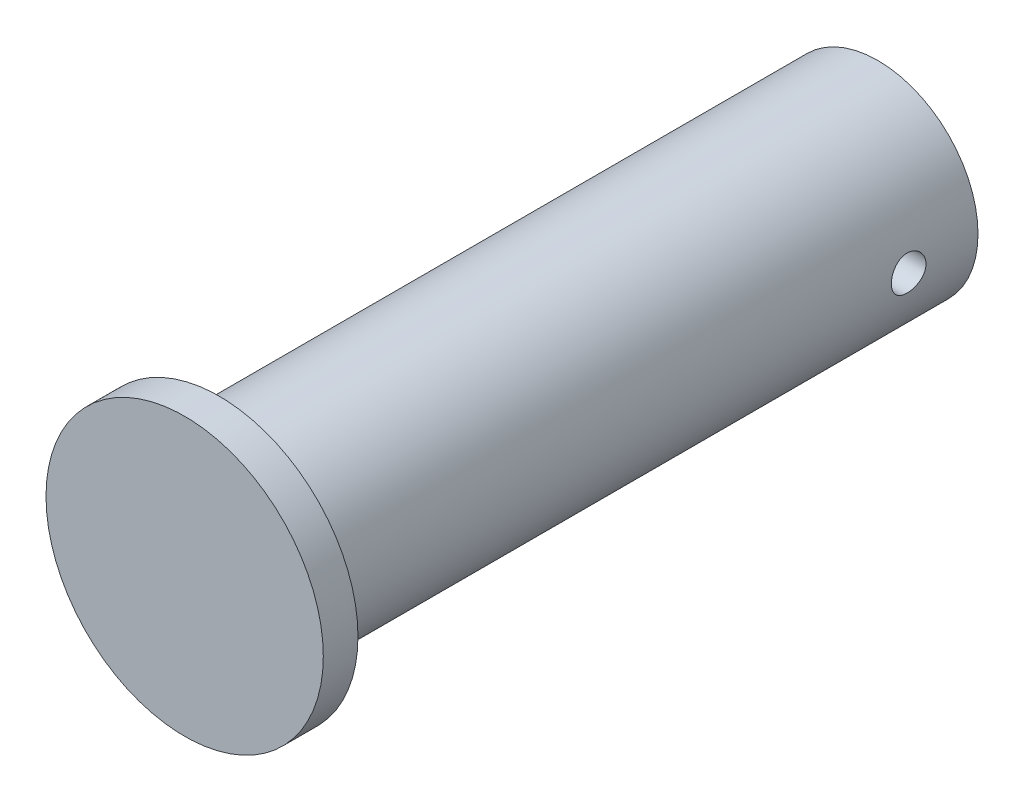
ISO-10303-21;
HEADER;
FILE_DESCRIPTION(('STEP AP214'),'2;1');
FILE_NAME('part.step','',(''),(''),'','','');
FILE_SCHEMA(('AUTOMOTIVE_DESIGN { 1 0 10303 214 1 1 1 1 }'));
ENDSEC;
DATA;
#1=APPLICATION_CONTEXT('core data for automotive mechanical design processes');
#2=APPLICATION_PROTOCOL_DEFINITION('international standard','automotive_design',2000,#1);
#3=PRODUCT_CONTEXT('',#1,'mechanical');
#4=PRODUCT('Part','Part','',(#3));
#5=PRODUCT_RELATED_PRODUCT_CATEGORY('part','',(#4));
#6=PRODUCT_DEFINITION_FORMATION('','',#4);
#7=PRODUCT_DEFINITION_CONTEXT('part definition',#1,'design');
#8=PRODUCT_DEFINITION('design','',#6,#7);
#9=PRODUCT_DEFINITION_SHAPE('','',#8);
#10=(LENGTH_UNIT() NAMED_UNIT(*) SI_UNIT(.MILLI.,.METRE.));
#11=(NAMED_UNIT(*) PLANE_ANGLE_UNIT() SI_UNIT($,.RADIAN.));
#12=(NAMED_UNIT(*) SI_UNIT($,.STERADIAN.) SOLID_ANGLE_UNIT());
#13=UNCERTAINTY_MEASURE_WITH_UNIT(LENGTH_MEASURE(1.E-05),#10,'distance_accuracy_value','');
#14=(GEOMETRIC_REPRESENTATION_CONTEXT(3) GLOBAL_UNCERTAINTY_ASSIGNED_CONTEXT((#13)) GLOBAL_UNIT_ASSIGNED_CONTEXT((#10,
#11,#12)) REPRESENTATION_CONTEXT('',''));
#15=CARTESIAN_POINT('',(0.,0.,0.));
#16=DIRECTION('',(0.,0.,1.));
#17=DIRECTION('',(1.,0.,0.));
#18=AXIS2_PLACEMENT_3D('',#15,#16,#17);
#19=CARTESIAN_POINT('',(0.,0.,100.));
#20=DIRECTION('',(0.,0.,-1.));
#21=DIRECTION('',(-1.,0.,0.));
#22=AXIS2_PLACEMENT_3D('',#19,#20,#21);
#23=CYLINDRICAL_SURFACE('',#22,14.44);
#24=CARTESIAN_POINT('',(-14.44,0.,12.5));
#25=CARTESIAN_POINT('',(-14.4399975634753,-0.13930998473073,12.49999448749));
#26=CARTESIAN_POINT('',(-14.4379630645383,-0.278693988960265,12.4883162957658));
#27=CARTESIAN_POINT('',(-14.43004300958,-0.553547196740739,12.4419346772616));
#28=CARTESIAN_POINT('',(-14.4241539990652,-0.689012774690595,12.4072105958845));
#29=CARTESIAN_POINT('',(-14.4091849248858,-0.952013276040617,12.3158216422762));
#30=CARTESIAN_POINT('',(-14.4001075536441,-1.07955478433479,12.2591752783003));
#31=CARTESIAN_POINT('',(-14.3797577944102,-1.32330820467692,12.1255994542479));
#32=CARTESIAN_POINT('',(-14.3684856354341,-1.43952129689679,12.0486721101037));
#33=CARTESIAN_POINT('',(-14.3448646796008,-1.6585289041156,11.8758771076849));
#34=CARTESIAN_POINT('',(-14.332506926838,-1.76119004399542,11.7798416106013));
#35=CARTESIAN_POINT('',(-14.3081755005597,-1.94902694553835,11.57191761267));
#36=CARTESIAN_POINT('',(-14.2962018522908,-2.03420155981216,11.460028072363));
#37=CARTESIAN_POINT('',(-14.2739075359928,-2.18518821661275,11.2226479708659));
#38=CARTESIAN_POINT('',(-14.2635984339907,-2.25086723151177,11.0970716155801));
#39=CARTESIAN_POINT('',(-14.2459253176367,-2.36014735110206,10.8364600028516));
#40=CARTESIAN_POINT('',(-14.2385610881339,-2.40375006873948,10.7014254372687));
#41=CARTESIAN_POINT('',(-14.2277009947425,-2.46721728094033,10.4271484628957));
#42=CARTESIAN_POINT('',(-14.2241675154832,-2.4873127581693,10.2879610210428));
#43=CARTESIAN_POINT('',(-14.2212553307796,-2.50391145576784,10.0081484969654));
#44=CARTESIAN_POINT('',(-14.2218763080439,-2.50041647782808,9.86752352534953));
#45=CARTESIAN_POINT('',(-14.2271685581324,-2.47012136396667,9.59048391104691));
#46=CARTESIAN_POINT('',(-14.2317945706192,-2.44358164359672,9.45403980013905));
#47=CARTESIAN_POINT('',(-14.24450473742,-2.36835951888826,9.18757062063627));
#48=CARTESIAN_POINT('',(-14.2525890188577,-2.31967630056528,9.05754578820577));
#49=CARTESIAN_POINT('',(-14.2713532513662,-2.20128789642092,8.80683176065407));
#50=CARTESIAN_POINT('',(-14.2820463891099,-2.13147546594887,8.68619423454585));
#51=CARTESIAN_POINT('',(-14.3048144671452,-1.97288640817707,8.45824739504153));
#52=CARTESIAN_POINT('',(-14.316889527519,-1.88410813225678,8.3509392415945));
#53=CARTESIAN_POINT('',(-14.3412592800245,-1.68869301497855,8.1511906403594));
#54=CARTESIAN_POINT('',(-14.3535547479139,-1.58183294249442,8.0589685360714));
#55=CARTESIAN_POINT('',(-14.3768307181355,-1.35404017782221,7.89373001464083));
#56=CARTESIAN_POINT('',(-14.3878112107046,-1.23310738116359,7.82071374008815));
#57=CARTESIAN_POINT('',(-14.4072374820732,-0.98039002286534,7.69593603315924));
#58=CARTESIAN_POINT('',(-14.4156808371998,-0.848595237147629,7.64419490720691));
#59=CARTESIAN_POINT('',(-14.4290622817102,-0.578007163834804,7.56364424508894));
#60=CARTESIAN_POINT('',(-14.4340006878184,-0.439214509815871,7.53483263687045));
#61=CARTESIAN_POINT('',(-14.4397729482183,-0.160451399039232,7.50125721480387));
#62=CARTESIAN_POINT('',(-14.4406579300303,-0.0205180457729643,7.49619383501322));
#63=CARTESIAN_POINT('',(-14.4383640191746,0.258196941472173,7.50945848559393));
#64=CARTESIAN_POINT('',(-14.4351852956913,0.396978623156529,7.52778554215017));
#65=CARTESIAN_POINT('',(-14.4251528430448,0.668518039124749,7.58706168003343));
#66=CARTESIAN_POINT('',(-14.4183233745228,0.801309336107092,7.62786147493437));
#67=CARTESIAN_POINT('',(-14.4017520509424,1.05816706221623,7.73076507268705));
#68=CARTESIAN_POINT('',(-14.3920100217737,1.18223296919933,7.79287014918184));
#69=CARTESIAN_POINT('',(-14.3705670866619,1.41941260238007,7.93730057568339));
#70=CARTESIAN_POINT('',(-14.3588485041966,1.5324114878356,8.01981183810103));
#71=CARTESIAN_POINT('',(-14.3348031542199,1.74306626598925,8.20245795916421));
#72=CARTESIAN_POINT('',(-14.3224763388626,1.84072094912045,8.30259420585041));
#73=CARTESIAN_POINT('',(-14.2984372168949,2.01903405834916,8.51899523647329));
#74=CARTESIAN_POINT('',(-14.2867333585016,2.09948945783996,8.63542840193452));
#75=CARTESIAN_POINT('',(-14.2654266293065,2.23969941207312,8.88033329400243));
#76=CARTESIAN_POINT('',(-14.2558236882063,2.29945465949875,9.00880461759687));
#77=CARTESIAN_POINT('',(-14.2398703425472,2.39626909782933,9.27358693007571));
#78=CARTESIAN_POINT('',(-14.2335058186822,2.43342695294202,9.40986095405076));
#79=CARTESIAN_POINT('',(-14.2247154135744,2.48430060628492,9.68683640895773));
#80=CARTESIAN_POINT('',(-14.2222891600036,2.49801862054801,9.82753742007555));
#81=CARTESIAN_POINT('',(-14.2216669114206,2.50155766954945,10.1073437274507));
#82=CARTESIAN_POINT('',(-14.2234143124217,2.49169846136465,10.2464449560352));
#83=CARTESIAN_POINT('',(-14.2308179955064,2.44905692701707,10.5209768264201));
#84=CARTESIAN_POINT('',(-14.2364742619462,2.41627469259618,10.6564074829085));
#85=CARTESIAN_POINT('',(-14.251036144411,2.32884394605321,10.9196157191706));
#86=CARTESIAN_POINT('',(-14.2599373518825,2.27422509131759,11.0474034097191));
#87=CARTESIAN_POINT('',(-14.2799900705008,2.14470495427614,11.2920532050755));
#88=CARTESIAN_POINT('',(-14.2911417076128,2.06980253654225,11.4089146977668));
#89=CARTESIAN_POINT('',(-14.3146171257375,1.90070904605433,11.6300063115008));
#90=CARTESIAN_POINT('',(-14.3269540775094,1.8062834602078,11.7340557030341));
#91=CARTESIAN_POINT('',(-14.3513069942516,1.60131714576919,11.9249411691269));
#92=CARTESIAN_POINT('',(-14.3633228846394,1.49077271063189,12.0117732736875));
#93=CARTESIAN_POINT('',(-14.3857848735948,1.25571662944174,12.1663599790899));
#94=CARTESIAN_POINT('',(-14.3962184989506,1.13110627951026,12.2339663362719));
#95=CARTESIAN_POINT('',(-14.4142189970937,0.872163903024424,12.347180750961));
#96=CARTESIAN_POINT('',(-14.4217886754054,0.7378415448439,12.3928103489445));
#97=CARTESIAN_POINT('',(-14.4315886163519,0.502527891769441,12.4510610677151));
#98=CARTESIAN_POINT('',(-14.4347257444371,0.4029466959307,12.4693831976672));
#99=CARTESIAN_POINT('',(-14.4389323006707,0.202256653770469,12.4938545465407));
#100=CARTESIAN_POINT('',(-14.4400017690707,0.101147837226107,12.50000400243));
#101=CARTESIAN_POINT('',(-14.44,0.,12.5));
#102=B_SPLINE_CURVE_WITH_KNOTS('',3,(#24,#25,#26,#27,#28,#29,#30,#31,#32,#33,#34,#35,#36,#37,
#38,#39,#40,#41,#42,#43,#44,#45,#46,#47,#48,#49,#50,#51,#52,#53,#54,#55,#56,#57,#58,#59,#60,#61,
#62,#63,#64,#65,#66,#67,#68,#69,#70,#71,#72,#73,#74,#75,#76,#77,#78,#79,#80,#81,#82,#83,#84,#85,
#86,#87,#88,#89,#90,#91,#92,#93,#94,#95,#96,#97,#98,#99,#100,#101),.UNSPECIFIED.,.T.,.F.,(4,2,2,
2,2,2,2,2,2,2,2,2,2,2,2,2,2,2,2,2,2,2,2,2,2,2,2,2,2,2,2,2,2,2,2,2,2,2,4),(0.,0.417560177156277,
0.835495093797418,1.25307792892817,1.67061721451096,2.09200022148706,2.51341086894182,
2.93763417454332,3.36182648091897,3.78181468891097,4.20177082120648,4.61704213414918,
5.03232871350195,5.44975953808841,5.86722666294179,6.29028427067342,6.71334501922416,
7.13680863312174,7.56023397588489,7.97830349922265,8.39635561762055,8.81166353559905,
9.22699628527232,9.64626215015434,10.0655610487492,10.4895652460589,10.9135552536666,
11.3356805004133,11.7577658366845,12.1741593367074,12.5905511702615,13.0063793923627,
13.4222308964023,13.8434026741225,14.2646714538878,14.6891054971974,15.113122681433,
15.4163036138014,15.7194786440245),.UNSPECIFIED.);
#103=CARTESIAN_POINT('',(-14.44,0.,12.5));
#104=VERTEX_POINT('',#103);
#105=EDGE_CURVE('E41',#104,#104,#102,.T.);
#106=ORIENTED_EDGE('',*,*,#105,.T.);
#107=EDGE_LOOP('',(#106));
#108=FACE_BOUND('',#107,.T.);
#109=CARTESIAN_POINT('',(14.44,0.,7.5));
#110=CARTESIAN_POINT('',(14.4399975634753,-0.139309984730729,7.50000551251004));
#111=CARTESIAN_POINT('',(14.4379630645383,-0.278693988960265,7.51168370423423));
#112=CARTESIAN_POINT('',(14.43004300958,-0.553547196740739,7.55806532273839));
#113=CARTESIAN_POINT('',(14.4241539990652,-0.689012774690595,7.59278940411548));
#114=CARTESIAN_POINT('',(14.4091849248858,-0.952013276040618,7.68417835772377));
#115=CARTESIAN_POINT('',(14.4001075536441,-1.07955478433479,7.74082472169975));
#116=CARTESIAN_POINT('',(14.3797577944102,-1.32330820467692,7.87440054575209));
#117=CARTESIAN_POINT('',(14.3684856354341,-1.43952129689679,7.95132788989631));
#118=CARTESIAN_POINT('',(14.3448646796008,-1.6585289041156,8.1241228923151));
#119=CARTESIAN_POINT('',(14.332506926838,-1.76119004399542,8.22015838939867));
#120=CARTESIAN_POINT('',(14.3081755005597,-1.94902694553835,8.42808238732996));
#121=CARTESIAN_POINT('',(14.2962018522908,-2.03420155981215,8.53997192763699));
#122=CARTESIAN_POINT('',(14.2739075359928,-2.18518821661275,8.77735202913412));
#123=CARTESIAN_POINT('',(14.2635984339907,-2.25086723151177,8.90292838441989));
#124=CARTESIAN_POINT('',(14.2459253176367,-2.36014735110206,9.16353999714842));
#125=CARTESIAN_POINT('',(14.2385610881339,-2.40375006873948,9.29857456273129));
#126=CARTESIAN_POINT('',(14.2277009947425,-2.46721728094033,9.57285153710427));
#127=CARTESIAN_POINT('',(14.2241675154832,-2.4873127581693,9.71203897895718));
#128=CARTESIAN_POINT('',(14.2212553307796,-2.50391145576784,9.99185150303456));
#129=CARTESIAN_POINT('',(14.2218763080439,-2.50041647782808,10.1324764746505));
#130=CARTESIAN_POINT('',(14.2271685581324,-2.47012136396667,10.4095160889531));
#131=CARTESIAN_POINT('',(14.2317945706192,-2.44358164359672,10.545960199861));
#132=CARTESIAN_POINT('',(14.24450473742,-2.36835951888826,10.8124293793637));
#133=CARTESIAN_POINT('',(14.2525890188577,-2.31967630056528,10.9424542117942));
#134=CARTESIAN_POINT('',(14.2713532513662,-2.20128789642092,11.1931682393459));
#135=CARTESIAN_POINT('',(14.2820463891099,-2.13147546594887,11.3138057654542));
#136=CARTESIAN_POINT('',(14.3048144671452,-1.97288640817707,11.5417526049585));
#137=CARTESIAN_POINT('',(14.316889527519,-1.88410813225678,11.6490607584055));
#138=CARTESIAN_POINT('',(14.3412592800245,-1.68869301497855,11.8488093596406));
#139=CARTESIAN_POINT('',(14.3535547479139,-1.58183294249442,11.9410314639286));
#140=CARTESIAN_POINT('',(14.3768307181355,-1.35404017782221,12.1062699853592));
#141=CARTESIAN_POINT('',(14.3878112107046,-1.23310738116359,12.1792862599119));
#142=CARTESIAN_POINT('',(14.4072374820732,-0.980390022865341,12.3040639668408));
#143=CARTESIAN_POINT('',(14.4156808371998,-0.848595237147629,12.3558050927931));
#144=CARTESIAN_POINT('',(14.4290622817102,-0.578007163834804,12.4363557549111));
#145=CARTESIAN_POINT('',(14.4340006878184,-0.43921450981587,12.4651673631296));
#146=CARTESIAN_POINT('',(14.4397729482183,-0.16045139903923,12.4987427851961));
#147=CARTESIAN_POINT('',(14.4406579300303,-0.0205180457729621,12.5038061649868));
#148=CARTESIAN_POINT('',(14.4383640191746,0.258196941472175,12.4905415144061));
#149=CARTESIAN_POINT('',(14.4351852956913,0.39697862315653,12.4722144578498));
#150=CARTESIAN_POINT('',(14.4251528430448,0.668518039124749,12.4129383199666));
#151=CARTESIAN_POINT('',(14.4183233745228,0.801309336107092,12.3721385250656));
#152=CARTESIAN_POINT('',(14.4017520509424,1.05816706221623,12.269234927313));
#153=CARTESIAN_POINT('',(14.3920100217737,1.18223296919933,12.2071298508182));
#154=CARTESIAN_POINT('',(14.3705670866618,1.41941260238007,12.0626994243166));
#155=CARTESIAN_POINT('',(14.3588485041966,1.5324114878356,11.980188161899));
#156=CARTESIAN_POINT('',(14.3348031542199,1.74306626598925,11.7975420408358));
#157=CARTESIAN_POINT('',(14.3224763388626,1.84072094912045,11.6974057941496));
#158=CARTESIAN_POINT('',(14.2984372168949,2.01903405834916,11.4810047635267));
#159=CARTESIAN_POINT('',(14.2867333585016,2.09948945783996,11.3645715980655));
#160=CARTESIAN_POINT('',(14.2654266293065,2.23969941207312,11.1196667059976));
#161=CARTESIAN_POINT('',(14.2558236882063,2.29945465949875,10.9911953824031));
#162=CARTESIAN_POINT('',(14.2398703425472,2.39626909782933,10.7264130699243));
#163=CARTESIAN_POINT('',(14.2335058186822,2.43342695294202,10.5901390459492));
#164=CARTESIAN_POINT('',(14.2247154135744,2.48430060628492,10.3131635910423));
#165=CARTESIAN_POINT('',(14.2222891600036,2.49801862054801,10.1724625799245));
#166=CARTESIAN_POINT('',(14.2216669114206,2.50155766954945,9.8926562725493));
#167=CARTESIAN_POINT('',(14.2234143124217,2.49169846136465,9.75355504396479));
#168=CARTESIAN_POINT('',(14.2308179955064,2.44905692701707,9.47902317357989));
#169=CARTESIAN_POINT('',(14.2364742619462,2.41627469259618,9.34359251709149));
#170=CARTESIAN_POINT('',(14.251036144411,2.32884394605321,9.08038428082942));
#171=CARTESIAN_POINT('',(14.2599373518825,2.27422509131759,8.95259659028093));
#172=CARTESIAN_POINT('',(14.2799900705008,2.14470495427614,8.70794679492446));
#173=CARTESIAN_POINT('',(14.2911417076128,2.06980253654225,8.59108530223316));
#174=CARTESIAN_POINT('',(14.3146171257375,1.90070904605433,8.36999368849924));
#175=CARTESIAN_POINT('',(14.3269540775094,1.8062834602078,8.26594429696591));
#176=CARTESIAN_POINT('',(14.3513069942516,1.60131714576919,8.07505883087305));
#177=CARTESIAN_POINT('',(14.3633228846394,1.49077271063189,7.98822672631249));
#178=CARTESIAN_POINT('',(14.3857848735948,1.25571662944174,7.8336400209101));
#179=CARTESIAN_POINT('',(14.3962184989506,1.13110627951026,7.76603366372813));
#180=CARTESIAN_POINT('',(14.4142189970937,0.872163903024424,7.652819249039));
#181=CARTESIAN_POINT('',(14.4217886754054,0.737841544843899,7.60718965105547));
#182=CARTESIAN_POINT('',(14.4315886163519,0.50252789176944,7.54893893228485));
#183=CARTESIAN_POINT('',(14.4347257444371,0.402946695930698,7.53061680233278));
#184=CARTESIAN_POINT('',(14.4389323006707,0.202256653770468,7.50614545345934));
#185=CARTESIAN_POINT('',(14.4400017690707,0.101147837226106,7.49999599756996));
#186=CARTESIAN_POINT('',(14.44,0.,7.5));
#187=B_SPLINE_CURVE_WITH_KNOTS('',3,(#109,#110,#111,#112,#113,#114,#115,#116,#117,#118,#119,
#120,#121,#122,#123,#124,#125,#126,#127,#128,#129,#130,#131,#132,#133,#134,#135,#136,#137,#138,
#139,#140,#141,#142,#143,#144,#145,#146,#147,#148,#149,#150,#151,#152,#153,#154,#155,#156,#157,
#158,#159,#160,#161,#162,#163,#164,#165,#166,#167,#168,#169,#170,#171,#172,#173,#174,#175,#176,
#177,#178,#179,#180,#181,#182,#183,#184,#185,#186),.UNSPECIFIED.,.T.,.F.,(4,2,2,2,2,2,2,2,2,2,2,
2,2,2,2,2,2,2,2,2,2,2,2,2,2,2,2,2,2,2,2,2,2,2,2,2,2,2,4),(0.,0.417560177156277,
0.835495093797419,1.25307792892817,1.67061721451096,2.09200022148707,2.51341086894182,
2.93763417454332,3.36182648091897,3.78181468891097,4.20177082120648,4.61704213414918,
5.03232871350195,5.44975953808841,5.86722666294179,6.29028427067343,6.71334501922416,
7.13680863312175,7.56023397588489,7.97830349922266,8.39635561762056,8.81166353559905,
9.22699628527233,9.64626215015434,10.0655610487492,10.489565246059,10.9135552536666,
11.3356805004133,11.7577658366845,12.1741593367074,12.5905511702615,13.0063793923628,
13.4222308964023,13.8434026741225,14.2646714538878,14.6891054971974,15.113122681433,
15.4163036138015,15.7194786440245),.UNSPECIFIED.);
#188=CARTESIAN_POINT('',(14.44,0.,7.5));
#189=VERTEX_POINT('',#188);
#190=EDGE_CURVE('E57',#189,#189,#187,.T.);
#191=ORIENTED_EDGE('',*,*,#190,.T.);
#192=EDGE_LOOP('',(#191));
#193=FACE_BOUND('',#192,.T.);
#194=CARTESIAN_POINT('',(0.,0.,0.));
#195=DIRECTION('',(0.,0.,1.));
#196=DIRECTION('',(1.,0.,0.));
#197=AXIS2_PLACEMENT_3D('',#194,#195,#196);
#198=CIRCLE('',#197,14.44);
#199=CARTESIAN_POINT('',(14.44,0.,0.));
#200=VERTEX_POINT('',#199);
#201=EDGE_CURVE('E49',#200,#200,#198,.T.);
#202=ORIENTED_EDGE('',*,*,#201,.T.);
#203=EDGE_LOOP('',(#202));
#204=FACE_BOUND('',#203,.T.);
#205=CARTESIAN_POINT('',(0.,0.,95.));
#206=DIRECTION('',(0.,0.,1.));
#207=DIRECTION('',(1.,0.,0.));
#208=AXIS2_PLACEMENT_3D('',#205,#206,#207);
#209=CIRCLE('',#208,14.44);
#210=CARTESIAN_POINT('',(14.44,0.,95.));
#211=VERTEX_POINT('',#210);
#212=EDGE_CURVE('E10',#211,#211,#209,.T.);
#213=ORIENTED_EDGE('',*,*,#212,.F.);
#214=EDGE_LOOP('',(#213));
#215=FACE_BOUND('',#214,.T.);
#216=ADVANCED_FACE('F37',(#108,#193,#204,#215),#23,.T.);
#217=CARTESIAN_POINT('',(0.,0.,0.));
#218=DIRECTION('',(0.,0.,1.));
#219=DIRECTION('',(1.,0.,0.));
#220=AXIS2_PLACEMENT_3D('',#217,#218,#219);
#221=PLANE('',#220);
#222=ORIENTED_EDGE('',*,*,#201,.F.);
#223=EDGE_LOOP('',(#222));
#224=FACE_BOUND('',#223,.T.);
#225=ADVANCED_FACE('F75',(#224),#221,.F.);
#226=CARTESIAN_POINT('',(0.,0.,95.));
#227=DIRECTION('',(0.,0.,1.));
#228=DIRECTION('',(1.,0.,0.));
#229=AXIS2_PLACEMENT_3D('',#226,#227,#228);
#230=CYLINDRICAL_SURFACE('',#229,20.);
#231=CARTESIAN_POINT('',(0.,0.,95.));
#232=DIRECTION('',(0.,0.,1.));
#233=DIRECTION('',(1.,0.,0.));
#234=AXIS2_PLACEMENT_3D('',#231,#232,#233);
#235=CIRCLE('',#234,20.);
#236=CARTESIAN_POINT('',(20.,0.,95.));
#237=VERTEX_POINT('',#236);
#238=EDGE_CURVE('E54',#237,#237,#235,.T.);
#239=ORIENTED_EDGE('',*,*,#238,.T.);
#240=EDGE_LOOP('',(#239));
#241=FACE_BOUND('',#240,.T.);
#242=CARTESIAN_POINT('',(0.,0.,100.));
#243=DIRECTION('',(0.,0.,1.));
#244=DIRECTION('',(1.,0.,0.));
#245=AXIS2_PLACEMENT_3D('',#242,#243,#244);
#246=CIRCLE('',#245,20.);
#247=CARTESIAN_POINT('',(20.,0.,100.));
#248=VERTEX_POINT('',#247);
#249=EDGE_CURVE('E97',#248,#248,#246,.T.);
#250=ORIENTED_EDGE('',*,*,#249,.F.);
#251=EDGE_LOOP('',(#250));
#252=FACE_BOUND('',#251,.T.);
#253=ADVANCED_FACE('F72',(#241,#252),#230,.T.);
#254=CARTESIAN_POINT('',(0.,0.,95.));
#255=DIRECTION('',(0.,0.,1.));
#256=DIRECTION('',(1.,0.,0.));
#257=AXIS2_PLACEMENT_3D('',#254,#255,#256);
#258=PLANE('',#257);
#259=ORIENTED_EDGE('',*,*,#212,.T.);
#260=EDGE_LOOP('',(#259));
#261=FACE_BOUND('',#260,.T.);
#262=ORIENTED_EDGE('',*,*,#238,.F.);
#263=EDGE_LOOP('',(#262));
#264=FACE_BOUND('',#263,.T.);
#265=ADVANCED_FACE('F68',(#261,#264),#258,.F.);
#266=CARTESIAN_POINT('',(0.,0.,100.));
#267=DIRECTION('',(0.,0.,1.));
#268=DIRECTION('',(1.,0.,0.));
#269=AXIS2_PLACEMENT_3D('',#266,#267,#268);
#270=PLANE('',#269);
#271=ORIENTED_EDGE('',*,*,#249,.T.);
#272=EDGE_LOOP('',(#271));
#273=FACE_BOUND('',#272,.T.);
#274=ADVANCED_FACE('F66',(#273),#270,.T.);
#275=CARTESIAN_POINT('',(-20.,0.,10.));
#276=DIRECTION('',(1.,0.,0.));
#277=DIRECTION('',(0.,0.,-1.));
#278=AXIS2_PLACEMENT_3D('',#275,#276,#277);
#279=CYLINDRICAL_SURFACE('',#278,2.5);
#280=ORIENTED_EDGE('',*,*,#190,.F.);
#281=EDGE_LOOP('',(#280));
#282=FACE_BOUND('',#281,.T.);
#283=ORIENTED_EDGE('',*,*,#105,.F.);
#284=EDGE_LOOP('',(#283));
#285=FACE_BOUND('',#284,.T.);
#286=ADVANCED_FACE('F62',(#282,#285),#279,.F.);
#287=CLOSED_SHELL('',(#216,#225,#253,#265,#274,#286));
#288=MANIFOLD_SOLID_BREP('B2',#287);
#289=ADVANCED_BREP_SHAPE_REPRESENTATION('',(#18,#288),#14);
#290=SHAPE_DEFINITION_REPRESENTATION(#9,#289);
ENDSEC;
END-ISO-10303-21;
